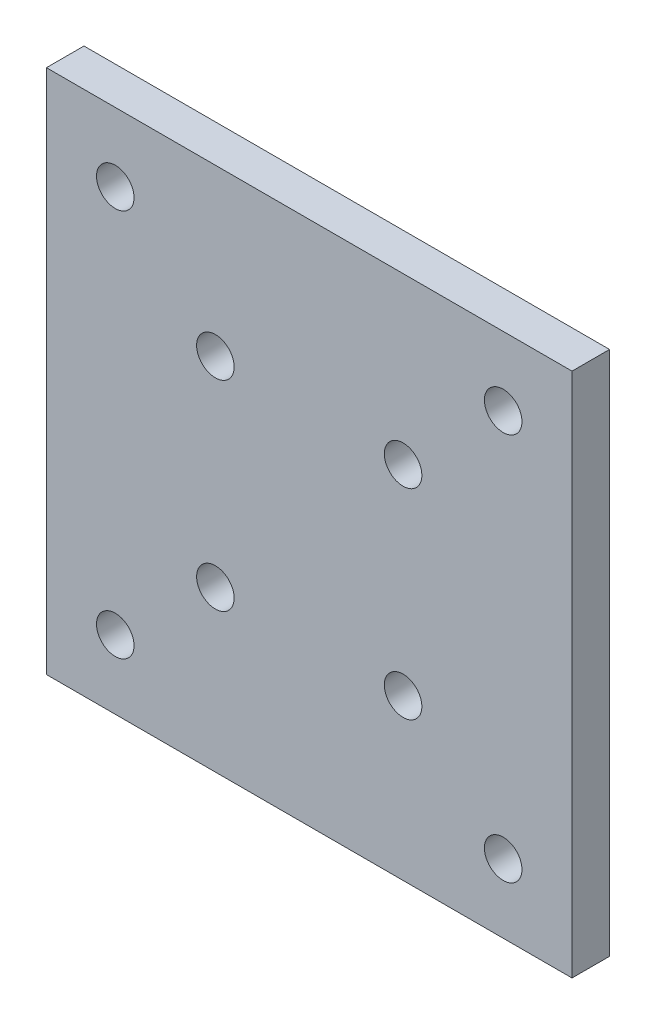
ISO-10303-21;
HEADER;
FILE_DESCRIPTION(('STEP AP214'),'2;1');
FILE_NAME('part.step','',(''),(''),'','','');
FILE_SCHEMA(('AUTOMOTIVE_DESIGN { 1 0 10303 214 1 1 1 1 }'));
ENDSEC;
DATA;
#1=APPLICATION_CONTEXT('core data for automotive mechanical design processes');
#2=APPLICATION_PROTOCOL_DEFINITION('international standard','automotive_design',2000,#1);
#3=PRODUCT_CONTEXT('',#1,'mechanical');
#4=PRODUCT('Part','Part','',(#3));
#5=PRODUCT_RELATED_PRODUCT_CATEGORY('part','',(#4));
#6=PRODUCT_DEFINITION_FORMATION('','',#4);
#7=PRODUCT_DEFINITION_CONTEXT('part definition',#1,'design');
#8=PRODUCT_DEFINITION('design','',#6,#7);
#9=PRODUCT_DEFINITION_SHAPE('','',#8);
#10=(LENGTH_UNIT() NAMED_UNIT(*) SI_UNIT(.MILLI.,.METRE.));
#11=(NAMED_UNIT(*) PLANE_ANGLE_UNIT() SI_UNIT($,.RADIAN.));
#12=(NAMED_UNIT(*) SI_UNIT($,.STERADIAN.) SOLID_ANGLE_UNIT());
#13=UNCERTAINTY_MEASURE_WITH_UNIT(LENGTH_MEASURE(1.E-05),#10,'distance_accuracy_value','');
#14=(GEOMETRIC_REPRESENTATION_CONTEXT(3) GLOBAL_UNCERTAINTY_ASSIGNED_CONTEXT((#13)) GLOBAL_UNIT_ASSIGNED_CONTEXT((#10,
#11,#12)) REPRESENTATION_CONTEXT('',''));
#15=CARTESIAN_POINT('',(0.,0.,0.));
#16=DIRECTION('',(0.,0.,1.));
#17=DIRECTION('',(1.,0.,0.));
#18=AXIS2_PLACEMENT_3D('',#15,#16,#17);
#19=CARTESIAN_POINT('',(0.,0.,3.));
#20=DIRECTION('',(0.,0.,-1.));
#21=DIRECTION('',(-1.,0.,0.));
#22=AXIS2_PLACEMENT_3D('',#19,#20,#21);
#23=PLANE('',#22);
#24=DIRECTION('',(0.,-1.,0.));
#25=VECTOR('',#24,1.);
#26=CARTESIAN_POINT('',(0.,0.,3.));
#27=LINE('',#26,#25);
#28=CARTESIAN_POINT('',(0.,42.,3.));
#29=VERTEX_POINT('',#28);
#30=CARTESIAN_POINT('',(0.,0.,3.));
#31=VERTEX_POINT('',#30);
#32=EDGE_CURVE('E92',#29,#31,#27,.T.);
#33=ORIENTED_EDGE('',*,*,#32,.T.);
#34=DIRECTION('',(1.,0.,0.));
#35=VECTOR('',#34,1.);
#36=CARTESIAN_POINT('',(0.,0.,3.));
#37=LINE('',#36,#35);
#38=CARTESIAN_POINT('',(42.,0.,3.));
#39=VERTEX_POINT('',#38);
#40=EDGE_CURVE('E87',#31,#39,#37,.T.);
#41=ORIENTED_EDGE('',*,*,#40,.T.);
#42=DIRECTION('',(0.,1.,0.));
#43=VECTOR('',#42,1.);
#44=CARTESIAN_POINT('',(42.,0.,3.));
#45=LINE('',#44,#43);
#46=CARTESIAN_POINT('',(42.,42.,3.));
#47=VERTEX_POINT('',#46);
#48=EDGE_CURVE('E90',#39,#47,#45,.T.);
#49=ORIENTED_EDGE('',*,*,#48,.T.);
#50=DIRECTION('',(-1.,0.,0.));
#51=VECTOR('',#50,1.);
#52=CARTESIAN_POINT('',(0.,42.,3.));
#53=LINE('',#52,#51);
#54=EDGE_CURVE('E57',#47,#29,#53,.T.);
#55=ORIENTED_EDGE('',*,*,#54,.T.);
#56=EDGE_LOOP('',(#33,#41,#49,#55));
#57=FACE_BOUND('',#56,.T.);
#58=CARTESIAN_POINT('',(5.5,36.5,3.));
#59=DIRECTION('',(0.,0.,1.));
#60=DIRECTION('',(1.,0.,0.));
#61=AXIS2_PLACEMENT_3D('',#58,#59,#60);
#62=CIRCLE('',#61,1.5);
#63=CARTESIAN_POINT('',(7.,36.5,3.));
#64=VERTEX_POINT('',#63);
#65=EDGE_CURVE('E112',#64,#64,#62,.T.);
#66=ORIENTED_EDGE('',*,*,#65,.F.);
#67=EDGE_LOOP('',(#66));
#68=FACE_BOUND('',#67,.T.);
#69=CARTESIAN_POINT('',(36.5,36.5,3.));
#70=DIRECTION('',(0.,0.,1.));
#71=DIRECTION('',(1.,0.,0.));
#72=AXIS2_PLACEMENT_3D('',#69,#70,#71);
#73=CIRCLE('',#72,1.5);
#74=CARTESIAN_POINT('',(38.,36.5,3.));
#75=VERTEX_POINT('',#74);
#76=EDGE_CURVE('E134',#75,#75,#73,.T.);
#77=ORIENTED_EDGE('',*,*,#76,.F.);
#78=EDGE_LOOP('',(#77));
#79=FACE_BOUND('',#78,.T.);
#80=CARTESIAN_POINT('',(36.5000000000003,5.50000000000001,3.));
#81=DIRECTION('',(0.,0.,1.));
#82=DIRECTION('',(1.,0.,0.));
#83=AXIS2_PLACEMENT_3D('',#80,#81,#82);
#84=CIRCLE('',#83,1.5);
#85=CARTESIAN_POINT('',(38.0000000000003,5.50000000000001,3.));
#86=VERTEX_POINT('',#85);
#87=EDGE_CURVE('E142',#86,#86,#84,.T.);
#88=ORIENTED_EDGE('',*,*,#87,.F.);
#89=EDGE_LOOP('',(#88));
#90=FACE_BOUND('',#89,.T.);
#91=CARTESIAN_POINT('',(5.50000000000032,5.50000000000001,3.));
#92=DIRECTION('',(0.,0.,1.));
#93=DIRECTION('',(1.,0.,0.));
#94=AXIS2_PLACEMENT_3D('',#91,#92,#93);
#95=CIRCLE('',#94,1.5);
#96=CARTESIAN_POINT('',(7.00000000000032,5.50000000000001,3.));
#97=VERTEX_POINT('',#96);
#98=EDGE_CURVE('E150',#97,#97,#95,.T.);
#99=ORIENTED_EDGE('',*,*,#98,.F.);
#100=EDGE_LOOP('',(#99));
#101=FACE_BOUND('',#100,.T.);
#102=CARTESIAN_POINT('',(13.5,28.7840724402404,3.));
#103=DIRECTION('',(0.,0.,1.));
#104=DIRECTION('',(1.,0.,0.));
#105=AXIS2_PLACEMENT_3D('',#102,#103,#104);
#106=CIRCLE('',#105,1.5);
#107=CARTESIAN_POINT('',(15.,28.7840724402404,3.));
#108=VERTEX_POINT('',#107);
#109=EDGE_CURVE('E158',#108,#108,#106,.T.);
#110=ORIENTED_EDGE('',*,*,#109,.F.);
#111=EDGE_LOOP('',(#110));
#112=FACE_BOUND('',#111,.T.);
#113=CARTESIAN_POINT('',(28.5,28.7840724402404,3.));
#114=DIRECTION('',(0.,0.,1.));
#115=DIRECTION('',(1.,0.,0.));
#116=AXIS2_PLACEMENT_3D('',#113,#114,#115);
#117=CIRCLE('',#116,1.5);
#118=CARTESIAN_POINT('',(30.,28.7840724402404,3.));
#119=VERTEX_POINT('',#118);
#120=EDGE_CURVE('E166',#119,#119,#117,.T.);
#121=ORIENTED_EDGE('',*,*,#120,.F.);
#122=EDGE_LOOP('',(#121));
#123=FACE_BOUND('',#122,.T.);
#124=CARTESIAN_POINT('',(28.5000000000002,12.7840724402404,3.));
#125=DIRECTION('',(0.,0.,1.));
#126=DIRECTION('',(1.,0.,0.));
#127=AXIS2_PLACEMENT_3D('',#124,#125,#126);
#128=CIRCLE('',#127,1.5);
#129=CARTESIAN_POINT('',(30.0000000000002,12.7840724402404,3.));
#130=VERTEX_POINT('',#129);
#131=EDGE_CURVE('E174',#130,#130,#128,.T.);
#132=ORIENTED_EDGE('',*,*,#131,.F.);
#133=EDGE_LOOP('',(#132));
#134=FACE_BOUND('',#133,.T.);
#135=CARTESIAN_POINT('',(13.5000000000002,12.7840724402404,3.));
#136=DIRECTION('',(0.,0.,1.));
#137=DIRECTION('',(1.,0.,0.));
#138=AXIS2_PLACEMENT_3D('',#135,#136,#137);
#139=CIRCLE('',#138,1.5);
#140=CARTESIAN_POINT('',(15.0000000000002,12.7840724402404,3.));
#141=VERTEX_POINT('',#140);
#142=EDGE_CURVE('E182',#141,#141,#139,.T.);
#143=ORIENTED_EDGE('',*,*,#142,.F.);
#144=EDGE_LOOP('',(#143));
#145=FACE_BOUND('',#144,.T.);
#146=ADVANCED_FACE('F39',(#57,#68,#79,#90,#101,#112,#123,#134,#145),#23,.F.);
#147=CARTESIAN_POINT('',(0.,0.,0.));
#148=DIRECTION('',(0.,0.,-1.));
#149=DIRECTION('',(-1.,0.,0.));
#150=AXIS2_PLACEMENT_3D('',#147,#148,#149);
#151=PLANE('',#150);
#152=CARTESIAN_POINT('',(28.5000000000002,12.7840724402404,0.));
#153=DIRECTION('',(0.,0.,1.));
#154=DIRECTION('',(1.,0.,0.));
#155=AXIS2_PLACEMENT_3D('',#152,#153,#154);
#156=CIRCLE('',#155,1.5);
#157=CARTESIAN_POINT('',(30.0000000000002,12.7840724402404,0.));
#158=VERTEX_POINT('',#157);
#159=EDGE_CURVE('E178',#158,#158,#156,.T.);
#160=ORIENTED_EDGE('',*,*,#159,.T.);
#161=EDGE_LOOP('',(#160));
#162=FACE_BOUND('',#161,.T.);
#163=CARTESIAN_POINT('',(13.5,28.7840724402404,0.));
#164=DIRECTION('',(0.,0.,1.));
#165=DIRECTION('',(1.,0.,0.));
#166=AXIS2_PLACEMENT_3D('',#163,#164,#165);
#167=CIRCLE('',#166,1.5);
#168=CARTESIAN_POINT('',(15.,28.7840724402404,0.));
#169=VERTEX_POINT('',#168);
#170=EDGE_CURVE('E162',#169,#169,#167,.T.);
#171=ORIENTED_EDGE('',*,*,#170,.T.);
#172=EDGE_LOOP('',(#171));
#173=FACE_BOUND('',#172,.T.);
#174=CARTESIAN_POINT('',(36.5000000000003,5.50000000000001,0.));
#175=DIRECTION('',(0.,0.,1.));
#176=DIRECTION('',(1.,0.,0.));
#177=AXIS2_PLACEMENT_3D('',#174,#175,#176);
#178=CIRCLE('',#177,1.5);
#179=CARTESIAN_POINT('',(38.0000000000003,5.50000000000001,0.));
#180=VERTEX_POINT('',#179);
#181=EDGE_CURVE('E146',#180,#180,#178,.T.);
#182=ORIENTED_EDGE('',*,*,#181,.T.);
#183=EDGE_LOOP('',(#182));
#184=FACE_BOUND('',#183,.T.);
#185=CARTESIAN_POINT('',(5.5,36.5,0.));
#186=DIRECTION('',(0.,0.,1.));
#187=DIRECTION('',(1.,0.,0.));
#188=AXIS2_PLACEMENT_3D('',#185,#186,#187);
#189=CIRCLE('',#188,1.5);
#190=CARTESIAN_POINT('',(7.,36.5,0.));
#191=VERTEX_POINT('',#190);
#192=EDGE_CURVE('E130',#191,#191,#189,.T.);
#193=ORIENTED_EDGE('',*,*,#192,.T.);
#194=EDGE_LOOP('',(#193));
#195=FACE_BOUND('',#194,.T.);
#196=DIRECTION('',(0.,-1.,0.));
#197=VECTOR('',#196,1.);
#198=CARTESIAN_POINT('',(0.,0.,0.));
#199=LINE('',#198,#197);
#200=CARTESIAN_POINT('',(0.,42.,0.));
#201=VERTEX_POINT('',#200);
#202=CARTESIAN_POINT('',(0.,0.,0.));
#203=VERTEX_POINT('',#202);
#204=EDGE_CURVE('E108',#201,#203,#199,.T.);
#205=ORIENTED_EDGE('',*,*,#204,.F.);
#206=DIRECTION('',(-1.,0.,0.));
#207=VECTOR('',#206,1.);
#208=CARTESIAN_POINT('',(0.,42.,0.));
#209=LINE('',#208,#207);
#210=CARTESIAN_POINT('',(42.,42.,0.));
#211=VERTEX_POINT('',#210);
#212=EDGE_CURVE('E80',#211,#201,#209,.T.);
#213=ORIENTED_EDGE('',*,*,#212,.F.);
#214=DIRECTION('',(0.,1.,0.));
#215=VECTOR('',#214,1.);
#216=CARTESIAN_POINT('',(42.,0.,0.));
#217=LINE('',#216,#215);
#218=CARTESIAN_POINT('',(42.,0.,0.));
#219=VERTEX_POINT('',#218);
#220=EDGE_CURVE('E74',#219,#211,#217,.T.);
#221=ORIENTED_EDGE('',*,*,#220,.F.);
#222=DIRECTION('',(1.,0.,0.));
#223=VECTOR('',#222,1.);
#224=CARTESIAN_POINT('',(0.,0.,0.));
#225=LINE('',#224,#223);
#226=EDGE_CURVE('E97',#203,#219,#225,.T.);
#227=ORIENTED_EDGE('',*,*,#226,.F.);
#228=EDGE_LOOP('',(#205,#213,#221,#227));
#229=FACE_BOUND('',#228,.T.);
#230=CARTESIAN_POINT('',(36.5,36.5,0.));
#231=DIRECTION('',(0.,0.,1.));
#232=DIRECTION('',(1.,0.,0.));
#233=AXIS2_PLACEMENT_3D('',#230,#231,#232);
#234=CIRCLE('',#233,1.5);
#235=CARTESIAN_POINT('',(38.,36.5,0.));
#236=VERTEX_POINT('',#235);
#237=EDGE_CURVE('E138',#236,#236,#234,.T.);
#238=ORIENTED_EDGE('',*,*,#237,.T.);
#239=EDGE_LOOP('',(#238));
#240=FACE_BOUND('',#239,.T.);
#241=CARTESIAN_POINT('',(5.50000000000032,5.50000000000001,0.));
#242=DIRECTION('',(0.,0.,1.));
#243=DIRECTION('',(1.,0.,0.));
#244=AXIS2_PLACEMENT_3D('',#241,#242,#243);
#245=CIRCLE('',#244,1.5);
#246=CARTESIAN_POINT('',(7.00000000000032,5.50000000000001,0.));
#247=VERTEX_POINT('',#246);
#248=EDGE_CURVE('E154',#247,#247,#245,.T.);
#249=ORIENTED_EDGE('',*,*,#248,.T.);
#250=EDGE_LOOP('',(#249));
#251=FACE_BOUND('',#250,.T.);
#252=CARTESIAN_POINT('',(28.5,28.7840724402404,0.));
#253=DIRECTION('',(0.,0.,1.));
#254=DIRECTION('',(1.,0.,0.));
#255=AXIS2_PLACEMENT_3D('',#252,#253,#254);
#256=CIRCLE('',#255,1.5);
#257=CARTESIAN_POINT('',(30.,28.7840724402404,0.));
#258=VERTEX_POINT('',#257);
#259=EDGE_CURVE('E170',#258,#258,#256,.T.);
#260=ORIENTED_EDGE('',*,*,#259,.T.);
#261=EDGE_LOOP('',(#260));
#262=FACE_BOUND('',#261,.T.);
#263=CARTESIAN_POINT('',(13.5000000000002,12.7840724402404,0.));
#264=DIRECTION('',(0.,0.,1.));
#265=DIRECTION('',(1.,0.,0.));
#266=AXIS2_PLACEMENT_3D('',#263,#264,#265);
#267=CIRCLE('',#266,1.5);
#268=CARTESIAN_POINT('',(15.0000000000002,12.7840724402404,0.));
#269=VERTEX_POINT('',#268);
#270=EDGE_CURVE('E186',#269,#269,#267,.T.);
#271=ORIENTED_EDGE('',*,*,#270,.T.);
#272=EDGE_LOOP('',(#271));
#273=FACE_BOUND('',#272,.T.);
#274=ADVANCED_FACE('F125',(#162,#173,#184,#195,#229,#240,#251,#262,#273),#151,.T.);
#275=CARTESIAN_POINT('',(0.,0.,3.));
#276=DIRECTION('',(1.,0.,0.));
#277=DIRECTION('',(0.,0.,-1.));
#278=AXIS2_PLACEMENT_3D('',#275,#276,#277);
#279=PLANE('',#278);
#280=ORIENTED_EDGE('',*,*,#204,.T.);
#281=DIRECTION('',(0.,0.,-1.));
#282=VECTOR('',#281,1.);
#283=CARTESIAN_POINT('',(0.,0.,3.));
#284=LINE('',#283,#282);
#285=EDGE_CURVE('E11',#31,#203,#284,.T.);
#286=ORIENTED_EDGE('',*,*,#285,.F.);
#287=ORIENTED_EDGE('',*,*,#32,.F.);
#288=DIRECTION('',(0.,0.,-1.));
#289=VECTOR('',#288,1.);
#290=CARTESIAN_POINT('',(0.,42.,3.));
#291=LINE('',#290,#289);
#292=EDGE_CURVE('E104',#29,#201,#291,.T.);
#293=ORIENTED_EDGE('',*,*,#292,.T.);
#294=EDGE_LOOP('',(#280,#286,#287,#293));
#295=FACE_BOUND('',#294,.T.);
#296=ADVANCED_FACE('F41',(#295),#279,.F.);
#297=CARTESIAN_POINT('',(0.,0.,3.));
#298=DIRECTION('',(0.,1.,0.));
#299=DIRECTION('',(0.,0.,1.));
#300=AXIS2_PLACEMENT_3D('',#297,#298,#299);
#301=PLANE('',#300);
#302=ORIENTED_EDGE('',*,*,#226,.T.);
#303=DIRECTION('',(0.,0.,-1.));
#304=VECTOR('',#303,1.);
#305=CARTESIAN_POINT('',(42.,0.,3.));
#306=LINE('',#305,#304);
#307=EDGE_CURVE('E49',#39,#219,#306,.T.);
#308=ORIENTED_EDGE('',*,*,#307,.F.);
#309=ORIENTED_EDGE('',*,*,#40,.F.);
#310=ORIENTED_EDGE('',*,*,#285,.T.);
#311=EDGE_LOOP('',(#302,#308,#309,#310));
#312=FACE_BOUND('',#311,.T.);
#313=ADVANCED_FACE('F96',(#312),#301,.F.);
#314=CARTESIAN_POINT('',(42.,0.,3.));
#315=DIRECTION('',(-1.,0.,0.));
#316=DIRECTION('',(0.,0.,1.));
#317=AXIS2_PLACEMENT_3D('',#314,#315,#316);
#318=PLANE('',#317);
#319=ORIENTED_EDGE('',*,*,#220,.T.);
#320=DIRECTION('',(0.,0.,-1.));
#321=VECTOR('',#320,1.);
#322=CARTESIAN_POINT('',(42.,42.,3.));
#323=LINE('',#322,#321);
#324=EDGE_CURVE('E99',#47,#211,#323,.T.);
#325=ORIENTED_EDGE('',*,*,#324,.F.);
#326=ORIENTED_EDGE('',*,*,#48,.F.);
#327=ORIENTED_EDGE('',*,*,#307,.T.);
#328=EDGE_LOOP('',(#319,#325,#326,#327));
#329=FACE_BOUND('',#328,.T.);
#330=ADVANCED_FACE('F100',(#329),#318,.F.);
#331=CARTESIAN_POINT('',(0.,42.,3.));
#332=DIRECTION('',(0.,-1.,0.));
#333=DIRECTION('',(0.,0.,-1.));
#334=AXIS2_PLACEMENT_3D('',#331,#332,#333);
#335=PLANE('',#334);
#336=ORIENTED_EDGE('',*,*,#212,.T.);
#337=ORIENTED_EDGE('',*,*,#292,.F.);
#338=ORIENTED_EDGE('',*,*,#54,.F.);
#339=ORIENTED_EDGE('',*,*,#324,.T.);
#340=EDGE_LOOP('',(#336,#337,#338,#339));
#341=FACE_BOUND('',#340,.T.);
#342=ADVANCED_FACE('F122',(#341),#335,.F.);
#343=CARTESIAN_POINT('',(5.5,36.5,3.));
#344=DIRECTION('',(0.,0.,-1.));
#345=DIRECTION('',(-1.,0.,0.));
#346=AXIS2_PLACEMENT_3D('',#343,#344,#345);
#347=CYLINDRICAL_SURFACE('',#346,1.5);
#348=ORIENTED_EDGE('',*,*,#65,.T.);
#349=EDGE_LOOP('',(#348));
#350=FACE_BOUND('',#349,.T.);
#351=ORIENTED_EDGE('',*,*,#192,.F.);
#352=EDGE_LOOP('',(#351));
#353=FACE_BOUND('',#352,.T.);
#354=ADVANCED_FACE('F205',(#350,#353),#347,.F.);
#355=CARTESIAN_POINT('',(36.5,36.5,3.));
#356=DIRECTION('',(0.,0.,-1.));
#357=DIRECTION('',(-1.,0.,0.));
#358=AXIS2_PLACEMENT_3D('',#355,#356,#357);
#359=CYLINDRICAL_SURFACE('',#358,1.5);
#360=ORIENTED_EDGE('',*,*,#76,.T.);
#361=EDGE_LOOP('',(#360));
#362=FACE_BOUND('',#361,.T.);
#363=ORIENTED_EDGE('',*,*,#237,.F.);
#364=EDGE_LOOP('',(#363));
#365=FACE_BOUND('',#364,.T.);
#366=ADVANCED_FACE('F251',(#362,#365),#359,.F.);
#367=CARTESIAN_POINT('',(36.5000000000003,5.50000000000001,3.));
#368=DIRECTION('',(0.,0.,-1.));
#369=DIRECTION('',(-1.,0.,0.));
#370=AXIS2_PLACEMENT_3D('',#367,#368,#369);
#371=CYLINDRICAL_SURFACE('',#370,1.5);
#372=ORIENTED_EDGE('',*,*,#87,.T.);
#373=EDGE_LOOP('',(#372));
#374=FACE_BOUND('',#373,.T.);
#375=ORIENTED_EDGE('',*,*,#181,.F.);
#376=EDGE_LOOP('',(#375));
#377=FACE_BOUND('',#376,.T.);
#378=ADVANCED_FACE('F259',(#374,#377),#371,.F.);
#379=CARTESIAN_POINT('',(5.50000000000032,5.50000000000001,3.));
#380=DIRECTION('',(0.,0.,-1.));
#381=DIRECTION('',(-1.,0.,0.));
#382=AXIS2_PLACEMENT_3D('',#379,#380,#381);
#383=CYLINDRICAL_SURFACE('',#382,1.5);
#384=ORIENTED_EDGE('',*,*,#98,.T.);
#385=EDGE_LOOP('',(#384));
#386=FACE_BOUND('',#385,.T.);
#387=ORIENTED_EDGE('',*,*,#248,.F.);
#388=EDGE_LOOP('',(#387));
#389=FACE_BOUND('',#388,.T.);
#390=ADVANCED_FACE('F267',(#386,#389),#383,.F.);
#391=CARTESIAN_POINT('',(13.5,28.7840724402404,3.));
#392=DIRECTION('',(0.,0.,-1.));
#393=DIRECTION('',(-1.,0.,0.));
#394=AXIS2_PLACEMENT_3D('',#391,#392,#393);
#395=CYLINDRICAL_SURFACE('',#394,1.5);
#396=ORIENTED_EDGE('',*,*,#109,.T.);
#397=EDGE_LOOP('',(#396));
#398=FACE_BOUND('',#397,.T.);
#399=ORIENTED_EDGE('',*,*,#170,.F.);
#400=EDGE_LOOP('',(#399));
#401=FACE_BOUND('',#400,.T.);
#402=ADVANCED_FACE('F276',(#398,#401),#395,.F.);
#403=CARTESIAN_POINT('',(28.5,28.7840724402404,3.));
#404=DIRECTION('',(0.,0.,-1.));
#405=DIRECTION('',(-1.,0.,0.));
#406=AXIS2_PLACEMENT_3D('',#403,#404,#405);
#407=CYLINDRICAL_SURFACE('',#406,1.5);
#408=ORIENTED_EDGE('',*,*,#120,.T.);
#409=EDGE_LOOP('',(#408));
#410=FACE_BOUND('',#409,.T.);
#411=ORIENTED_EDGE('',*,*,#259,.F.);
#412=EDGE_LOOP('',(#411));
#413=FACE_BOUND('',#412,.T.);
#414=ADVANCED_FACE('F285',(#410,#413),#407,.F.);
#415=CARTESIAN_POINT('',(28.5000000000002,12.7840724402404,3.));
#416=DIRECTION('',(0.,0.,-1.));
#417=DIRECTION('',(-1.,0.,0.));
#418=AXIS2_PLACEMENT_3D('',#415,#416,#417);
#419=CYLINDRICAL_SURFACE('',#418,1.5);
#420=ORIENTED_EDGE('',*,*,#131,.T.);
#421=EDGE_LOOP('',(#420));
#422=FACE_BOUND('',#421,.T.);
#423=ORIENTED_EDGE('',*,*,#159,.F.);
#424=EDGE_LOOP('',(#423));
#425=FACE_BOUND('',#424,.T.);
#426=ADVANCED_FACE('F294',(#422,#425),#419,.F.);
#427=CARTESIAN_POINT('',(13.5000000000002,12.7840724402404,3.));
#428=DIRECTION('',(0.,0.,-1.));
#429=DIRECTION('',(-1.,0.,0.));
#430=AXIS2_PLACEMENT_3D('',#427,#428,#429);
#431=CYLINDRICAL_SURFACE('',#430,1.5);
#432=ORIENTED_EDGE('',*,*,#142,.T.);
#433=EDGE_LOOP('',(#432));
#434=FACE_BOUND('',#433,.T.);
#435=ORIENTED_EDGE('',*,*,#270,.F.);
#436=EDGE_LOOP('',(#435));
#437=FACE_BOUND('',#436,.T.);
#438=ADVANCED_FACE('F194',(#434,#437),#431,.F.);
#439=CLOSED_SHELL('',(#146,#274,#296,#313,#330,#342,#354,#366,#378,#390,#402,#414,#426,#438));
#440=MANIFOLD_SOLID_BREP('B2',#439);
#441=ADVANCED_BREP_SHAPE_REPRESENTATION('',(#18,#440),#14);
#442=SHAPE_DEFINITION_REPRESENTATION(#9,#441);
ENDSEC;
END-ISO-10303-21;
